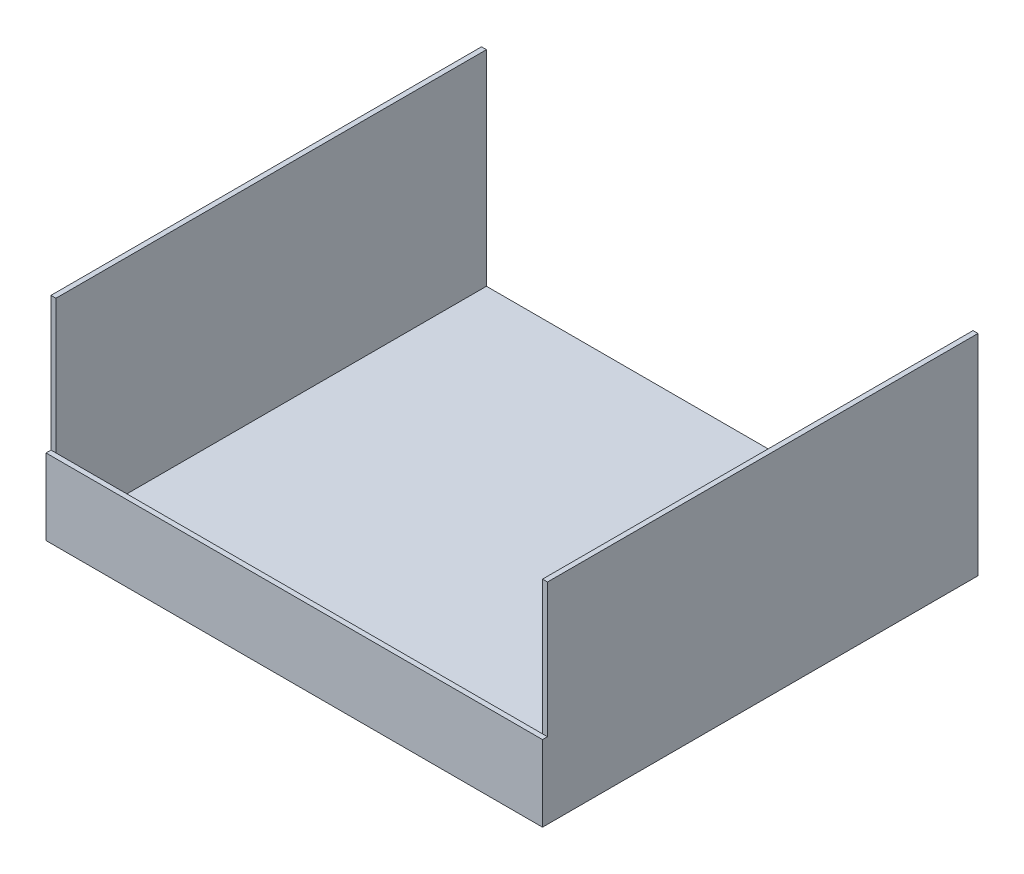
ISO-10303-21;
HEADER;
FILE_DESCRIPTION(('STEP AP214'),'2;1');
FILE_NAME('part.step','',(''),(''),'','','');
FILE_SCHEMA(('AUTOMOTIVE_DESIGN { 1 0 10303 214 1 1 1 1 }'));
ENDSEC;
DATA;
#1=APPLICATION_CONTEXT('core data for automotive mechanical design processes');
#2=APPLICATION_PROTOCOL_DEFINITION('international standard','automotive_design',2000,#1);
#3=PRODUCT_CONTEXT('',#1,'mechanical');
#4=PRODUCT('Part','Part','',(#3));
#5=PRODUCT_RELATED_PRODUCT_CATEGORY('part','',(#4));
#6=PRODUCT_DEFINITION_FORMATION('','',#4);
#7=PRODUCT_DEFINITION_CONTEXT('part definition',#1,'design');
#8=PRODUCT_DEFINITION('design','',#6,#7);
#9=PRODUCT_DEFINITION_SHAPE('','',#8);
#10=(LENGTH_UNIT() NAMED_UNIT(*) SI_UNIT(.MILLI.,.METRE.));
#11=(NAMED_UNIT(*) PLANE_ANGLE_UNIT() SI_UNIT($,.RADIAN.));
#12=(NAMED_UNIT(*) SI_UNIT($,.STERADIAN.) SOLID_ANGLE_UNIT());
#13=UNCERTAINTY_MEASURE_WITH_UNIT(LENGTH_MEASURE(1.E-05),#10,'distance_accuracy_value','');
#14=(GEOMETRIC_REPRESENTATION_CONTEXT(3) GLOBAL_UNCERTAINTY_ASSIGNED_CONTEXT((#13)) GLOBAL_UNIT_ASSIGNED_CONTEXT((#10,
#11,#12)) REPRESENTATION_CONTEXT('',''));
#15=CARTESIAN_POINT('',(0.,0.,0.));
#16=DIRECTION('',(0.,0.,1.));
#17=DIRECTION('',(1.,0.,0.));
#18=AXIS2_PLACEMENT_3D('',#15,#16,#17);
#19=CARTESIAN_POINT('',(0.,2.,0.));
#20=DIRECTION('',(0.,1.,0.));
#21=DIRECTION('',(0.,0.,1.));
#22=AXIS2_PLACEMENT_3D('',#19,#20,#21);
#23=PLANE('',#22);
#24=DIRECTION('',(1.,0.,0.));
#25=VECTOR('',#24,1.);
#26=CARTESIAN_POINT('',(-111.324541543541,2.,39.7171583491189));
#27=LINE('',#26,#25);
#28=CARTESIAN_POINT('',(-109.324541543541,2.,39.7171583491189));
#29=VERTEX_POINT('',#28);
#30=CARTESIAN_POINT('',(86.7004584564588,2.,39.7171583491189));
#31=VERTEX_POINT('',#30);
#32=EDGE_CURVE('E142',#29,#31,#27,.T.);
#33=ORIENTED_EDGE('',*,*,#32,.T.);
#34=DIRECTION('',(0.,0.,1.));
#35=VECTOR('',#34,1.);
#36=CARTESIAN_POINT('',(86.7004584564588,2.,-133.732841650881));
#37=LINE('',#36,#35);
#38=CARTESIAN_POINT('',(86.7004584564588,2.,-133.732841650881));
#39=VERTEX_POINT('',#38);
#40=EDGE_CURVE('E153',#39,#31,#37,.T.);
#41=ORIENTED_EDGE('',*,*,#40,.F.);
#42=DIRECTION('',(-1.,0.,0.));
#43=VECTOR('',#42,1.);
#44=CARTESIAN_POINT('',(-111.324541543541,2.,-133.732841650881));
#45=LINE('',#44,#43);
#46=CARTESIAN_POINT('',(-109.324541543541,2.,-133.732841650881));
#47=VERTEX_POINT('',#46);
#48=EDGE_CURVE('E60',#39,#47,#45,.T.);
#49=ORIENTED_EDGE('',*,*,#48,.T.);
#50=DIRECTION('',(0.,0.,-1.));
#51=VECTOR('',#50,1.);
#52=CARTESIAN_POINT('',(-109.324541543541,2.,-133.732841650881));
#53=LINE('',#52,#51);
#54=EDGE_CURVE('E174',#29,#47,#53,.T.);
#55=ORIENTED_EDGE('',*,*,#54,.F.);
#56=EDGE_LOOP('',(#33,#41,#49,#55));
#57=FACE_BOUND('',#56,.T.);
#58=ADVANCED_FACE('F38',(#57),#23,.T.);
#59=CARTESIAN_POINT('',(-111.324541543541,2.,-133.732841650881));
#60=DIRECTION('',(1.,0.,0.));
#61=DIRECTION('',(0.,0.,-1.));
#62=AXIS2_PLACEMENT_3D('',#59,#60,#61);
#63=PLANE('',#62);
#64=DIRECTION('',(0.,-1.,0.));
#65=VECTOR('',#64,1.);
#66=CARTESIAN_POINT('',(-111.324541543541,2.,41.7171583491189));
#67=LINE('',#66,#65);
#68=CARTESIAN_POINT('',(-111.324541543541,30.575,41.7171583491189));
#69=VERTEX_POINT('',#68);
#70=CARTESIAN_POINT('',(-111.324541543541,0.,41.7171583491189));
#71=VERTEX_POINT('',#70);
#72=EDGE_CURVE('E46',#69,#71,#67,.T.);
#73=ORIENTED_EDGE('',*,*,#72,.F.);
#74=DIRECTION('',(0.,0.,1.));
#75=VECTOR('',#74,1.);
#76=CARTESIAN_POINT('',(-111.324541543541,30.575,39.7171583491189));
#77=LINE('',#76,#75);
#78=CARTESIAN_POINT('',(-111.324541543541,30.575,39.7171583491189));
#79=VERTEX_POINT('',#78);
#80=EDGE_CURVE('E126',#79,#69,#77,.T.);
#81=ORIENTED_EDGE('',*,*,#80,.F.);
#82=DIRECTION('',(0.,-1.,0.));
#83=VECTOR('',#82,1.);
#84=CARTESIAN_POINT('',(-111.324541543541,84.55,39.7171583491189));
#85=LINE('',#84,#83);
#86=CARTESIAN_POINT('',(-111.324541543541,84.55,39.7171583491189));
#87=VERTEX_POINT('',#86);
#88=EDGE_CURVE('E192',#87,#79,#85,.T.);
#89=ORIENTED_EDGE('',*,*,#88,.F.);
#90=DIRECTION('',(0.,0.,1.));
#91=VECTOR('',#90,1.);
#92=CARTESIAN_POINT('',(-111.324541543541,84.55,-133.732841650881));
#93=LINE('',#92,#91);
#94=CARTESIAN_POINT('',(-111.324541543541,84.55,-133.732841650881));
#95=VERTEX_POINT('',#94);
#96=EDGE_CURVE('E175',#95,#87,#93,.T.);
#97=ORIENTED_EDGE('',*,*,#96,.F.);
#98=DIRECTION('',(0.,-1.,0.));
#99=VECTOR('',#98,1.);
#100=CARTESIAN_POINT('',(-111.324541543541,2.,-133.732841650881));
#101=LINE('',#100,#99);
#102=CARTESIAN_POINT('',(-111.324541543541,0.,-133.732841650881));
#103=VERTEX_POINT('',#102);
#104=EDGE_CURVE('E195',#95,#103,#101,.T.);
#105=ORIENTED_EDGE('',*,*,#104,.T.);
#106=DIRECTION('',(0.,0.,1.));
#107=VECTOR('',#106,1.);
#108=CARTESIAN_POINT('',(-111.324541543541,0.,-133.732841650881));
#109=LINE('',#108,#107);
#110=EDGE_CURVE('E130',#103,#71,#109,.T.);
#111=ORIENTED_EDGE('',*,*,#110,.T.);
#112=EDGE_LOOP('',(#73,#81,#89,#97,#105,#111));
#113=FACE_BOUND('',#112,.T.);
#114=ADVANCED_FACE('F40',(#113),#63,.F.);
#115=CARTESIAN_POINT('',(-111.324541543541,2.,41.7171583491189));
#116=DIRECTION('',(0.,0.,-1.));
#117=DIRECTION('',(-1.,0.,0.));
#118=AXIS2_PLACEMENT_3D('',#115,#116,#117);
#119=PLANE('',#118);
#120=DIRECTION('',(1.,0.,0.));
#121=VECTOR('',#120,1.);
#122=CARTESIAN_POINT('',(-111.324541543541,0.,41.7171583491189));
#123=LINE('',#122,#121);
#124=CARTESIAN_POINT('',(88.7004584564588,0.,41.7171583491189));
#125=VERTEX_POINT('',#124);
#126=EDGE_CURVE('E198',#71,#125,#123,.T.);
#127=ORIENTED_EDGE('',*,*,#126,.T.);
#128=DIRECTION('',(0.,-1.,0.));
#129=VECTOR('',#128,1.);
#130=CARTESIAN_POINT('',(88.7004584564588,2.,41.7171583491189));
#131=LINE('',#130,#129);
#132=CARTESIAN_POINT('',(88.7004584564588,30.575,41.7171583491189));
#133=VERTEX_POINT('',#132);
#134=EDGE_CURVE('E132',#133,#125,#131,.T.);
#135=ORIENTED_EDGE('',*,*,#134,.F.);
#136=DIRECTION('',(1.,0.,0.));
#137=VECTOR('',#136,1.);
#138=CARTESIAN_POINT('',(-111.324541543541,30.575,41.7171583491189));
#139=LINE('',#138,#137);
#140=EDGE_CURVE('E133',#69,#133,#139,.T.);
#141=ORIENTED_EDGE('',*,*,#140,.F.);
#142=ORIENTED_EDGE('',*,*,#72,.T.);
#143=EDGE_LOOP('',(#127,#135,#141,#142));
#144=FACE_BOUND('',#143,.T.);
#145=ADVANCED_FACE('F134',(#144),#119,.F.);
#146=CARTESIAN_POINT('',(88.7004584564588,2.,-133.732841650881));
#147=DIRECTION('',(-1.,0.,0.));
#148=DIRECTION('',(0.,0.,1.));
#149=AXIS2_PLACEMENT_3D('',#146,#147,#148);
#150=PLANE('',#149);
#151=DIRECTION('',(0.,0.,-1.));
#152=VECTOR('',#151,1.);
#153=CARTESIAN_POINT('',(88.7004584564588,0.,-133.732841650881));
#154=LINE('',#153,#152);
#155=CARTESIAN_POINT('',(88.7004584564588,0.,-133.732841650881));
#156=VERTEX_POINT('',#155);
#157=EDGE_CURVE('E200',#125,#156,#154,.T.);
#158=ORIENTED_EDGE('',*,*,#157,.T.);
#159=DIRECTION('',(0.,-1.,0.));
#160=VECTOR('',#159,1.);
#161=CARTESIAN_POINT('',(88.7004584564588,2.,-133.732841650881));
#162=LINE('',#161,#160);
#163=CARTESIAN_POINT('',(88.7004584564588,84.55,-133.732841650881));
#164=VERTEX_POINT('',#163);
#165=EDGE_CURVE('E204',#164,#156,#162,.T.);
#166=ORIENTED_EDGE('',*,*,#165,.F.);
#167=DIRECTION('',(0.,0.,-1.));
#168=VECTOR('',#167,1.);
#169=CARTESIAN_POINT('',(88.7004584564588,84.55,-133.732841650881));
#170=LINE('',#169,#168);
#171=CARTESIAN_POINT('',(88.7004584564588,84.55,39.7171583491189));
#172=VERTEX_POINT('',#171);
#173=EDGE_CURVE('E154',#172,#164,#170,.T.);
#174=ORIENTED_EDGE('',*,*,#173,.F.);
#175=DIRECTION('',(0.,-1.,0.));
#176=VECTOR('',#175,1.);
#177=CARTESIAN_POINT('',(88.7004584564588,84.55,39.7171583491189));
#178=LINE('',#177,#176);
#179=CARTESIAN_POINT('',(88.7004584564588,30.575,39.7171583491189));
#180=VERTEX_POINT('',#179);
#181=EDGE_CURVE('E163',#172,#180,#178,.T.);
#182=ORIENTED_EDGE('',*,*,#181,.T.);
#183=DIRECTION('',(0.,0.,1.));
#184=VECTOR('',#183,1.);
#185=CARTESIAN_POINT('',(88.7004584564588,30.575,39.7171583491189));
#186=LINE('',#185,#184);
#187=EDGE_CURVE('E53',#180,#133,#186,.T.);
#188=ORIENTED_EDGE('',*,*,#187,.T.);
#189=ORIENTED_EDGE('',*,*,#134,.T.);
#190=EDGE_LOOP('',(#158,#166,#174,#182,#188,#189));
#191=FACE_BOUND('',#190,.T.);
#192=ADVANCED_FACE('F209',(#191),#150,.F.);
#193=CARTESIAN_POINT('',(-111.324541543541,2.,-133.732841650881));
#194=DIRECTION('',(0.,0.,1.));
#195=DIRECTION('',(1.,0.,0.));
#196=AXIS2_PLACEMENT_3D('',#193,#194,#195);
#197=PLANE('',#196);
#198=DIRECTION('',(-1.,0.,0.));
#199=VECTOR('',#198,1.);
#200=CARTESIAN_POINT('',(-111.324541543541,0.,-133.732841650881));
#201=LINE('',#200,#199);
#202=EDGE_CURVE('E196',#156,#103,#201,.T.);
#203=ORIENTED_EDGE('',*,*,#202,.T.);
#204=ORIENTED_EDGE('',*,*,#104,.F.);
#205=DIRECTION('',(-1.,0.,0.));
#206=VECTOR('',#205,1.);
#207=CARTESIAN_POINT('',(-111.324541543541,84.55,-133.732841650881));
#208=LINE('',#207,#206);
#209=CARTESIAN_POINT('',(-109.324541543541,84.55,-133.732841650881));
#210=VERTEX_POINT('',#209);
#211=EDGE_CURVE('E182',#210,#95,#208,.T.);
#212=ORIENTED_EDGE('',*,*,#211,.F.);
#213=DIRECTION('',(0.,-1.,0.));
#214=VECTOR('',#213,1.);
#215=CARTESIAN_POINT('',(-109.324541543541,84.55,-133.732841650881));
#216=LINE('',#215,#214);
#217=EDGE_CURVE('E185',#210,#47,#216,.T.);
#218=ORIENTED_EDGE('',*,*,#217,.T.);
#219=ORIENTED_EDGE('',*,*,#48,.F.);
#220=DIRECTION('',(0.,-1.,0.));
#221=VECTOR('',#220,1.);
#222=CARTESIAN_POINT('',(86.7004584564588,84.55,-133.732841650881));
#223=LINE('',#222,#221);
#224=CARTESIAN_POINT('',(86.7004584564588,84.55,-133.732841650881));
#225=VERTEX_POINT('',#224);
#226=EDGE_CURVE('E172',#225,#39,#223,.T.);
#227=ORIENTED_EDGE('',*,*,#226,.F.);
#228=DIRECTION('',(-1.,0.,0.));
#229=VECTOR('',#228,1.);
#230=CARTESIAN_POINT('',(88.7004584564588,84.55,-133.732841650881));
#231=LINE('',#230,#229);
#232=EDGE_CURVE('E157',#164,#225,#231,.T.);
#233=ORIENTED_EDGE('',*,*,#232,.F.);
#234=ORIENTED_EDGE('',*,*,#165,.T.);
#235=EDGE_LOOP('',(#203,#204,#212,#218,#219,#227,#233,#234));
#236=FACE_BOUND('',#235,.T.);
#237=ADVANCED_FACE('F214',(#236),#197,.F.);
#238=CARTESIAN_POINT('',(0.,0.,0.));
#239=DIRECTION('',(0.,1.,0.));
#240=DIRECTION('',(0.,0.,1.));
#241=AXIS2_PLACEMENT_3D('',#238,#239,#240);
#242=PLANE('',#241);
#243=ORIENTED_EDGE('',*,*,#110,.F.);
#244=ORIENTED_EDGE('',*,*,#202,.F.);
#245=ORIENTED_EDGE('',*,*,#157,.F.);
#246=ORIENTED_EDGE('',*,*,#126,.F.);
#247=EDGE_LOOP('',(#243,#244,#245,#246));
#248=FACE_BOUND('',#247,.T.);
#249=ADVANCED_FACE('F212',(#248),#242,.F.);
#250=CARTESIAN_POINT('',(-111.324541543541,84.55,39.7171583491189));
#251=DIRECTION('',(0.,0.,-1.));
#252=DIRECTION('',(-1.,0.,0.));
#253=AXIS2_PLACEMENT_3D('',#250,#251,#252);
#254=PLANE('',#253);
#255=ORIENTED_EDGE('',*,*,#88,.T.);
#256=DIRECTION('',(1.,0.,0.));
#257=VECTOR('',#256,1.);
#258=CARTESIAN_POINT('',(-111.324541543541,30.575,39.7171583491189));
#259=LINE('',#258,#257);
#260=CARTESIAN_POINT('',(-109.324541543541,30.575,39.7171583491189));
#261=VERTEX_POINT('',#260);
#262=EDGE_CURVE('E140',#79,#261,#259,.T.);
#263=ORIENTED_EDGE('',*,*,#262,.T.);
#264=DIRECTION('',(0.,-1.,0.));
#265=VECTOR('',#264,1.);
#266=CARTESIAN_POINT('',(-109.324541543541,84.55,39.7171583491189));
#267=LINE('',#266,#265);
#268=CARTESIAN_POINT('',(-109.324541543541,84.55,39.7171583491189));
#269=VERTEX_POINT('',#268);
#270=EDGE_CURVE('E189',#269,#261,#267,.T.);
#271=ORIENTED_EDGE('',*,*,#270,.F.);
#272=DIRECTION('',(1.,0.,0.));
#273=VECTOR('',#272,1.);
#274=CARTESIAN_POINT('',(-111.324541543541,84.55,39.7171583491189));
#275=LINE('',#274,#273);
#276=EDGE_CURVE('E178',#87,#269,#275,.T.);
#277=ORIENTED_EDGE('',*,*,#276,.F.);
#278=EDGE_LOOP('',(#255,#263,#271,#277));
#279=FACE_BOUND('',#278,.T.);
#280=ADVANCED_FACE('F256',(#279),#254,.F.);
#281=CARTESIAN_POINT('',(-109.324541543541,84.55,-133.732841650881));
#282=DIRECTION('',(-1.,0.,0.));
#283=DIRECTION('',(0.,0.,1.));
#284=AXIS2_PLACEMENT_3D('',#281,#282,#283);
#285=PLANE('',#284);
#286=ORIENTED_EDGE('',*,*,#54,.T.);
#287=ORIENTED_EDGE('',*,*,#217,.F.);
#288=DIRECTION('',(0.,0.,-1.));
#289=VECTOR('',#288,1.);
#290=CARTESIAN_POINT('',(-109.324541543541,84.55,-133.732841650881));
#291=LINE('',#290,#289);
#292=EDGE_CURVE('E180',#269,#210,#291,.T.);
#293=ORIENTED_EDGE('',*,*,#292,.F.);
#294=ORIENTED_EDGE('',*,*,#270,.T.);
#295=DIRECTION('',(0.,-1.,0.));
#296=VECTOR('',#295,1.);
#297=CARTESIAN_POINT('',(-109.324541543541,84.55,39.7171583491189));
#298=LINE('',#297,#296);
#299=EDGE_CURVE('E149',#261,#29,#298,.T.);
#300=ORIENTED_EDGE('',*,*,#299,.T.);
#301=EDGE_LOOP('',(#286,#287,#293,#294,#300));
#302=FACE_BOUND('',#301,.T.);
#303=ADVANCED_FACE('F225',(#302),#285,.F.);
#304=CARTESIAN_POINT('',(0.,84.55,0.));
#305=DIRECTION('',(0.,1.,0.));
#306=DIRECTION('',(0.,0.,1.));
#307=AXIS2_PLACEMENT_3D('',#304,#305,#306);
#308=PLANE('',#307);
#309=ORIENTED_EDGE('',*,*,#96,.T.);
#310=ORIENTED_EDGE('',*,*,#276,.T.);
#311=ORIENTED_EDGE('',*,*,#292,.T.);
#312=ORIENTED_EDGE('',*,*,#211,.T.);
#313=EDGE_LOOP('',(#309,#310,#311,#312));
#314=FACE_BOUND('',#313,.T.);
#315=ADVANCED_FACE('F219',(#314),#308,.T.);
#316=CARTESIAN_POINT('',(86.7004584564588,84.55,-133.732841650881));
#317=DIRECTION('',(1.,0.,0.));
#318=DIRECTION('',(0.,0.,-1.));
#319=AXIS2_PLACEMENT_3D('',#316,#317,#318);
#320=PLANE('',#319);
#321=ORIENTED_EDGE('',*,*,#40,.T.);
#322=DIRECTION('',(0.,-1.,0.));
#323=VECTOR('',#322,1.);
#324=CARTESIAN_POINT('',(86.7004584564588,84.55,39.7171583491189));
#325=LINE('',#324,#323);
#326=CARTESIAN_POINT('',(86.7004584564588,30.575,39.7171583491189));
#327=VERTEX_POINT('',#326);
#328=EDGE_CURVE('E168',#327,#31,#325,.T.);
#329=ORIENTED_EDGE('',*,*,#328,.F.);
#330=CARTESIAN_POINT('',(86.7004584564588,84.55,39.7171583491189));
#331=VERTEX_POINT('',#330);
#332=EDGE_CURVE('E169',#331,#327,#325,.T.);
#333=ORIENTED_EDGE('',*,*,#332,.F.);
#334=DIRECTION('',(0.,0.,1.));
#335=VECTOR('',#334,1.);
#336=CARTESIAN_POINT('',(86.7004584564588,84.55,-133.732841650881));
#337=LINE('',#336,#335);
#338=EDGE_CURVE('E159',#225,#331,#337,.T.);
#339=ORIENTED_EDGE('',*,*,#338,.F.);
#340=ORIENTED_EDGE('',*,*,#226,.T.);
#341=EDGE_LOOP('',(#321,#329,#333,#339,#340));
#342=FACE_BOUND('',#341,.T.);
#343=ADVANCED_FACE('F229',(#342),#320,.F.);
#344=CARTESIAN_POINT('',(88.7004584564588,84.55,39.7171583491189));
#345=DIRECTION('',(0.,0.,-1.));
#346=DIRECTION('',(-1.,0.,0.));
#347=AXIS2_PLACEMENT_3D('',#344,#345,#346);
#348=PLANE('',#347);
#349=ORIENTED_EDGE('',*,*,#332,.T.);
#350=DIRECTION('',(1.,0.,0.));
#351=VECTOR('',#350,1.);
#352=CARTESIAN_POINT('',(88.7004584564588,30.575,39.7171583491189));
#353=LINE('',#352,#351);
#354=EDGE_CURVE('E11',#327,#180,#353,.T.);
#355=ORIENTED_EDGE('',*,*,#354,.T.);
#356=ORIENTED_EDGE('',*,*,#181,.F.);
#357=DIRECTION('',(1.,0.,0.));
#358=VECTOR('',#357,1.);
#359=CARTESIAN_POINT('',(88.7004584564588,84.55,39.7171583491189));
#360=LINE('',#359,#358);
#361=EDGE_CURVE('E161',#331,#172,#360,.T.);
#362=ORIENTED_EDGE('',*,*,#361,.F.);
#363=EDGE_LOOP('',(#349,#355,#356,#362));
#364=FACE_BOUND('',#363,.T.);
#365=ADVANCED_FACE('F238',(#364),#348,.F.);
#366=CARTESIAN_POINT('',(0.,84.55,0.));
#367=DIRECTION('',(0.,-1.,0.));
#368=DIRECTION('',(0.,0.,-1.));
#369=AXIS2_PLACEMENT_3D('',#366,#367,#368);
#370=PLANE('',#369);
#371=ORIENTED_EDGE('',*,*,#173,.T.);
#372=ORIENTED_EDGE('',*,*,#232,.T.);
#373=ORIENTED_EDGE('',*,*,#338,.T.);
#374=ORIENTED_EDGE('',*,*,#361,.T.);
#375=EDGE_LOOP('',(#371,#372,#373,#374));
#376=FACE_BOUND('',#375,.T.);
#377=ADVANCED_FACE('F234',(#376),#370,.F.);
#378=CARTESIAN_POINT('',(-111.324541543541,30.575,39.7171583491189));
#379=DIRECTION('',(0.,0.,-1.));
#380=DIRECTION('',(-1.,0.,0.));
#381=AXIS2_PLACEMENT_3D('',#378,#379,#380);
#382=PLANE('',#381);
#383=ORIENTED_EDGE('',*,*,#299,.F.);
#384=EDGE_CURVE('E148',#261,#327,#259,.T.);
#385=ORIENTED_EDGE('',*,*,#384,.T.);
#386=ORIENTED_EDGE('',*,*,#328,.T.);
#387=ORIENTED_EDGE('',*,*,#32,.F.);
#388=EDGE_LOOP('',(#383,#385,#386,#387));
#389=FACE_BOUND('',#388,.T.);
#390=ADVANCED_FACE('F240',(#389),#382,.T.);
#391=CARTESIAN_POINT('',(0.,30.575,0.));
#392=DIRECTION('',(0.,1.,0.));
#393=DIRECTION('',(0.,0.,1.));
#394=AXIS2_PLACEMENT_3D('',#391,#392,#393);
#395=PLANE('',#394);
#396=ORIENTED_EDGE('',*,*,#80,.T.);
#397=ORIENTED_EDGE('',*,*,#140,.T.);
#398=ORIENTED_EDGE('',*,*,#187,.F.);
#399=ORIENTED_EDGE('',*,*,#354,.F.);
#400=ORIENTED_EDGE('',*,*,#384,.F.);
#401=ORIENTED_EDGE('',*,*,#262,.F.);
#402=EDGE_LOOP('',(#396,#397,#398,#399,#400,#401));
#403=FACE_BOUND('',#402,.T.);
#404=ADVANCED_FACE('F137',(#403),#395,.T.);
#405=CLOSED_SHELL('',(#58,#114,#145,#192,#237,#249,#280,#303,#315,#343,#365,#377,#390,#404));
#406=MANIFOLD_SOLID_BREP('B2',#405);
#407=ADVANCED_BREP_SHAPE_REPRESENTATION('',(#18,#406),#14);
#408=SHAPE_DEFINITION_REPRESENTATION(#9,#407);
ENDSEC;
END-ISO-10303-21;
